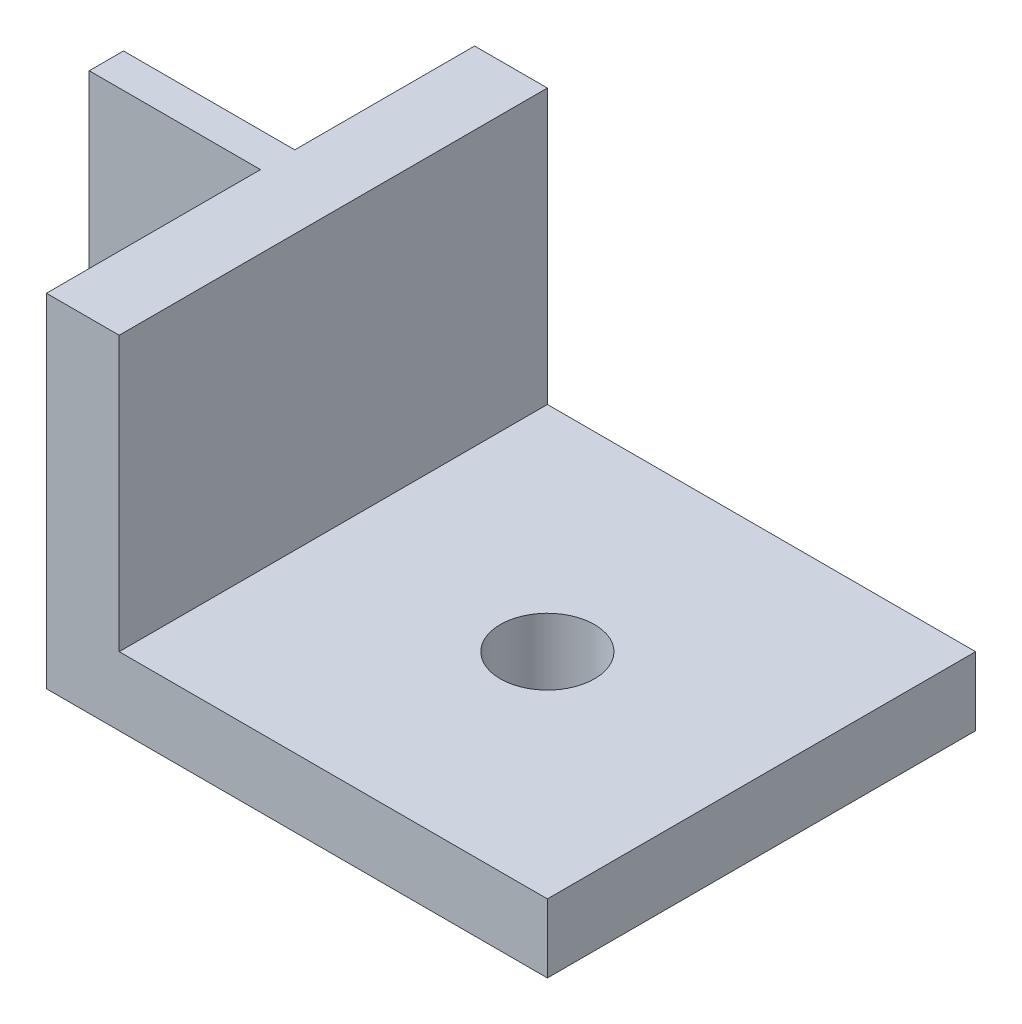
ISO-10303-21;
HEADER;
FILE_DESCRIPTION(('STEP AP214'),'2;1');
FILE_NAME('part.step','',(''),(''),'','','');
FILE_SCHEMA(('AUTOMOTIVE_DESIGN { 1 0 10303 214 1 1 1 1 }'));
ENDSEC;
DATA;
#1=APPLICATION_CONTEXT('core data for automotive mechanical design processes');
#2=APPLICATION_PROTOCOL_DEFINITION('international standard','automotive_design',2000,#1);
#3=PRODUCT_CONTEXT('',#1,'mechanical');
#4=PRODUCT('Part','Part','',(#3));
#5=PRODUCT_RELATED_PRODUCT_CATEGORY('part','',(#4));
#6=PRODUCT_DEFINITION_FORMATION('','',#4);
#7=PRODUCT_DEFINITION_CONTEXT('part definition',#1,'design');
#8=PRODUCT_DEFINITION('design','',#6,#7);
#9=PRODUCT_DEFINITION_SHAPE('','',#8);
#10=(LENGTH_UNIT() NAMED_UNIT(*) SI_UNIT(.MILLI.,.METRE.));
#11=(NAMED_UNIT(*) PLANE_ANGLE_UNIT() SI_UNIT($,.RADIAN.));
#12=(NAMED_UNIT(*) SI_UNIT($,.STERADIAN.) SOLID_ANGLE_UNIT());
#13=UNCERTAINTY_MEASURE_WITH_UNIT(LENGTH_MEASURE(1.E-05),#10,'distance_accuracy_value','');
#14=(GEOMETRIC_REPRESENTATION_CONTEXT(3) GLOBAL_UNCERTAINTY_ASSIGNED_CONTEXT((#13)) GLOBAL_UNIT_ASSIGNED_CONTEXT((#10,
#11,#12)) REPRESENTATION_CONTEXT('',''));
#15=CARTESIAN_POINT('',(0.,0.,0.));
#16=DIRECTION('',(0.,0.,1.));
#17=DIRECTION('',(1.,0.,0.));
#18=AXIS2_PLACEMENT_3D('',#15,#16,#17);
#19=CARTESIAN_POINT('',(-16.7491144139302,-23.,-12.5));
#20=DIRECTION('',(1.,0.,0.));
#21=DIRECTION('',(0.,0.,-1.));
#22=AXIS2_PLACEMENT_3D('',#19,#20,#21);
#23=PLANE('',#22);
#24=DIRECTION('',(0.,1.,0.));
#25=VECTOR('',#24,1.);
#26=CARTESIAN_POINT('',(-16.7491144139302,-10.1980390271856,0.));
#27=LINE('',#26,#25);
#28=CARTESIAN_POINT('',(-16.7491144139302,0.,0.));
#29=VERTEX_POINT('',#28);
#30=CARTESIAN_POINT('',(-16.7491144139302,20.,0.));
#31=VERTEX_POINT('',#30);
#32=EDGE_CURVE('E71',#29,#31,#27,.T.);
#33=ORIENTED_EDGE('',*,*,#32,.F.);
#34=DIRECTION('',(0.,0.,-1.));
#35=VECTOR('',#34,1.);
#36=CARTESIAN_POINT('',(-16.7491144139302,0.,0.));
#37=LINE('',#36,#35);
#38=CARTESIAN_POINT('',(-16.7491144139302,0.,12.5));
#39=VERTEX_POINT('',#38);
#40=EDGE_CURVE('E183',#39,#29,#37,.T.);
#41=ORIENTED_EDGE('',*,*,#40,.F.);
#42=DIRECTION('',(0.,1.,0.));
#43=VECTOR('',#42,1.);
#44=CARTESIAN_POINT('',(-16.7491144139302,-23.,12.5));
#45=LINE('',#44,#43);
#46=CARTESIAN_POINT('',(-16.7491144139302,20.,12.5));
#47=VERTEX_POINT('',#46);
#48=EDGE_CURVE('E176',#39,#47,#45,.T.);
#49=ORIENTED_EDGE('',*,*,#48,.T.);
#50=DIRECTION('',(0.,0.,-1.));
#51=VECTOR('',#50,1.);
#52=CARTESIAN_POINT('',(-16.7491144139302,20.,-12.5));
#53=LINE('',#52,#51);
#54=EDGE_CURVE('E173',#47,#31,#53,.T.);
#55=ORIENTED_EDGE('',*,*,#54,.T.);
#56=EDGE_LOOP('',(#33,#41,#49,#55));
#57=FACE_BOUND('',#56,.T.);
#58=ADVANCED_FACE('F47',(#57),#23,.F.);
#59=CARTESIAN_POINT('',(12.5,4.,0.));
#60=DIRECTION('',(1.,0.,0.));
#61=DIRECTION('',(0.,0.,-1.));
#62=AXIS2_PLACEMENT_3D('',#59,#60,#61);
#63=PLANE('',#62);
#64=DIRECTION('',(0.,0.,1.));
#65=VECTOR('',#64,1.);
#66=CARTESIAN_POINT('',(12.5,0.,0.));
#67=LINE('',#66,#65);
#68=CARTESIAN_POINT('',(12.5,0.,-12.5));
#69=VERTEX_POINT('',#68);
#70=CARTESIAN_POINT('',(12.5,0.,12.5));
#71=VERTEX_POINT('',#70);
#72=EDGE_CURVE('E226',#69,#71,#67,.T.);
#73=ORIENTED_EDGE('',*,*,#72,.F.);
#74=DIRECTION('',(0.,-1.,0.));
#75=VECTOR('',#74,1.);
#76=CARTESIAN_POINT('',(12.5,4.,-12.5));
#77=LINE('',#76,#75);
#78=CARTESIAN_POINT('',(12.5,4.,-12.5));
#79=VERTEX_POINT('',#78);
#80=EDGE_CURVE('E11',#79,#69,#77,.T.);
#81=ORIENTED_EDGE('',*,*,#80,.F.);
#82=DIRECTION('',(0.,0.,1.));
#83=VECTOR('',#82,1.);
#84=CARTESIAN_POINT('',(12.5,4.,0.));
#85=LINE('',#84,#83);
#86=CARTESIAN_POINT('',(12.5,4.,12.5));
#87=VERTEX_POINT('',#86);
#88=EDGE_CURVE('E208',#79,#87,#85,.T.);
#89=ORIENTED_EDGE('',*,*,#88,.T.);
#90=DIRECTION('',(0.,-1.,0.));
#91=VECTOR('',#90,1.);
#92=CARTESIAN_POINT('',(12.5,4.,12.5));
#93=LINE('',#92,#91);
#94=EDGE_CURVE('E56',#87,#71,#93,.T.);
#95=ORIENTED_EDGE('',*,*,#94,.T.);
#96=EDGE_LOOP('',(#73,#81,#89,#95));
#97=FACE_BOUND('',#96,.T.);
#98=ADVANCED_FACE('F239',(#97),#63,.T.);
#99=CARTESIAN_POINT('',(0.,4.,-12.5));
#100=DIRECTION('',(0.,0.,-1.));
#101=DIRECTION('',(-1.,0.,0.));
#102=AXIS2_PLACEMENT_3D('',#99,#100,#101);
#103=PLANE('',#102);
#104=DIRECTION('',(0.,1.,0.));
#105=VECTOR('',#104,1.);
#106=CARTESIAN_POINT('',(-16.7491144139302,-23.,-12.5));
#107=LINE('',#106,#105);
#108=CARTESIAN_POINT('',(-16.7491144139302,0.,-12.5));
#109=VERTEX_POINT('',#108);
#110=CARTESIAN_POINT('',(-16.7491144139302,20.,-12.5));
#111=VERTEX_POINT('',#110);
#112=EDGE_CURVE('E177',#109,#111,#107,.T.);
#113=ORIENTED_EDGE('',*,*,#112,.T.);
#114=DIRECTION('',(-1.,0.,0.));
#115=VECTOR('',#114,1.);
#116=CARTESIAN_POINT('',(0.,20.,-12.5));
#117=LINE('',#116,#115);
#118=CARTESIAN_POINT('',(-12.5,20.,-12.5));
#119=VERTEX_POINT('',#118);
#120=EDGE_CURVE('E194',#119,#111,#117,.T.);
#121=ORIENTED_EDGE('',*,*,#120,.F.);
#122=DIRECTION('',(0.,-1.,0.));
#123=VECTOR('',#122,1.);
#124=CARTESIAN_POINT('',(-12.5,20.,-12.5));
#125=LINE('',#124,#123);
#126=CARTESIAN_POINT('',(-12.5,4.,-12.5));
#127=VERTEX_POINT('',#126);
#128=EDGE_CURVE('E197',#119,#127,#125,.T.);
#129=ORIENTED_EDGE('',*,*,#128,.T.);
#130=DIRECTION('',(1.,0.,0.));
#131=VECTOR('',#130,1.);
#132=CARTESIAN_POINT('',(0.,4.,-12.5));
#133=LINE('',#132,#131);
#134=EDGE_CURVE('E213',#127,#79,#133,.T.);
#135=ORIENTED_EDGE('',*,*,#134,.T.);
#136=ORIENTED_EDGE('',*,*,#80,.T.);
#137=DIRECTION('',(1.,0.,0.));
#138=VECTOR('',#137,1.);
#139=CARTESIAN_POINT('',(0.,0.,-12.5));
#140=LINE('',#139,#138);
#141=EDGE_CURVE('E230',#109,#69,#140,.T.);
#142=ORIENTED_EDGE('',*,*,#141,.F.);
#143=EDGE_LOOP('',(#113,#121,#129,#135,#136,#142));
#144=FACE_BOUND('',#143,.T.);
#145=ADVANCED_FACE('F248',(#144),#103,.T.);
#146=CARTESIAN_POINT('',(0.,4.,0.));
#147=DIRECTION('',(0.,-1.,0.));
#148=DIRECTION('',(0.,0.,-1.));
#149=AXIS2_PLACEMENT_3D('',#146,#147,#148);
#150=CYLINDRICAL_SURFACE('',#149,2.75);
#151=CARTESIAN_POINT('',(0.,4.,0.));
#152=DIRECTION('',(0.,1.,0.));
#153=DIRECTION('',(0.,0.,1.));
#154=AXIS2_PLACEMENT_3D('',#151,#152,#153);
#155=CIRCLE('',#154,2.75);
#156=CARTESIAN_POINT('',(0.,4.,2.75));
#157=VERTEX_POINT('',#156);
#158=EDGE_CURVE('E205',#157,#157,#155,.T.);
#159=ORIENTED_EDGE('',*,*,#158,.T.);
#160=EDGE_LOOP('',(#159));
#161=FACE_BOUND('',#160,.T.);
#162=CARTESIAN_POINT('',(0.,0.,0.));
#163=DIRECTION('',(0.,1.,0.));
#164=DIRECTION('',(0.,0.,1.));
#165=AXIS2_PLACEMENT_3D('',#162,#163,#164);
#166=CIRCLE('',#165,2.75);
#167=CARTESIAN_POINT('',(0.,0.,2.75));
#168=VERTEX_POINT('',#167);
#169=EDGE_CURVE('E204',#168,#168,#166,.T.);
#170=ORIENTED_EDGE('',*,*,#169,.F.);
#171=EDGE_LOOP('',(#170));
#172=FACE_BOUND('',#171,.T.);
#173=ADVANCED_FACE('F49',(#161,#172),#150,.F.);
#174=CARTESIAN_POINT('',(0.,4.,12.5));
#175=DIRECTION('',(0.,0.,-1.));
#176=DIRECTION('',(-1.,0.,0.));
#177=AXIS2_PLACEMENT_3D('',#174,#175,#176);
#178=PLANE('',#177);
#179=DIRECTION('',(-1.,0.,0.));
#180=VECTOR('',#179,1.);
#181=CARTESIAN_POINT('',(0.,20.,12.5));
#182=LINE('',#181,#180);
#183=CARTESIAN_POINT('',(-12.5,20.,12.5));
#184=VERTEX_POINT('',#183);
#185=EDGE_CURVE('E186',#184,#47,#182,.T.);
#186=ORIENTED_EDGE('',*,*,#185,.T.);
#187=ORIENTED_EDGE('',*,*,#48,.F.);
#188=DIRECTION('',(1.,0.,0.));
#189=VECTOR('',#188,1.);
#190=CARTESIAN_POINT('',(0.,0.,12.5));
#191=LINE('',#190,#189);
#192=EDGE_CURVE('E209',#39,#71,#191,.T.);
#193=ORIENTED_EDGE('',*,*,#192,.T.);
#194=ORIENTED_EDGE('',*,*,#94,.F.);
#195=DIRECTION('',(1.,0.,0.));
#196=VECTOR('',#195,1.);
#197=CARTESIAN_POINT('',(0.,4.,12.5));
#198=LINE('',#197,#196);
#199=CARTESIAN_POINT('',(-12.5,4.,12.5));
#200=VERTEX_POINT('',#199);
#201=EDGE_CURVE('E220',#200,#87,#198,.T.);
#202=ORIENTED_EDGE('',*,*,#201,.F.);
#203=DIRECTION('',(0.,-1.,0.));
#204=VECTOR('',#203,1.);
#205=CARTESIAN_POINT('',(-12.5,20.,12.5));
#206=LINE('',#205,#204);
#207=EDGE_CURVE('E201',#184,#200,#206,.T.);
#208=ORIENTED_EDGE('',*,*,#207,.F.);
#209=EDGE_LOOP('',(#186,#187,#193,#194,#202,#208));
#210=FACE_BOUND('',#209,.T.);
#211=ADVANCED_FACE('F252',(#210),#178,.F.);
#212=CARTESIAN_POINT('',(0.,4.,0.));
#213=DIRECTION('',(0.,1.,0.));
#214=DIRECTION('',(0.,0.,1.));
#215=AXIS2_PLACEMENT_3D('',#212,#213,#214);
#216=PLANE('',#215);
#217=ORIENTED_EDGE('',*,*,#158,.F.);
#218=EDGE_LOOP('',(#217));
#219=FACE_BOUND('',#218,.T.);
#220=ORIENTED_EDGE('',*,*,#88,.F.);
#221=ORIENTED_EDGE('',*,*,#134,.F.);
#222=DIRECTION('',(0.,0.,1.));
#223=VECTOR('',#222,1.);
#224=CARTESIAN_POINT('',(-12.5,4.,0.));
#225=LINE('',#224,#223);
#226=EDGE_CURVE('E216',#127,#200,#225,.T.);
#227=ORIENTED_EDGE('',*,*,#226,.T.);
#228=ORIENTED_EDGE('',*,*,#201,.T.);
#229=EDGE_LOOP('',(#220,#221,#227,#228));
#230=FACE_BOUND('',#229,.T.);
#231=ADVANCED_FACE('F251',(#219,#230),#216,.T.);
#232=CARTESIAN_POINT('',(0.,0.,0.));
#233=DIRECTION('',(0.,1.,0.));
#234=DIRECTION('',(0.,0.,1.));
#235=AXIS2_PLACEMENT_3D('',#232,#233,#234);
#236=PLANE('',#235);
#237=ORIENTED_EDGE('',*,*,#169,.T.);
#238=EDGE_LOOP('',(#237));
#239=FACE_BOUND('',#238,.T.);
#240=ORIENTED_EDGE('',*,*,#192,.F.);
#241=ORIENTED_EDGE('',*,*,#40,.T.);
#242=DIRECTION('',(-1.,0.,0.));
#243=VECTOR('',#242,1.);
#244=CARTESIAN_POINT('',(-16.7491144139302,0.,0.));
#245=LINE('',#244,#243);
#246=CARTESIAN_POINT('',(-26.7491144139302,0.,0.));
#247=VERTEX_POINT('',#246);
#248=EDGE_CURVE('E159',#29,#247,#245,.T.);
#249=ORIENTED_EDGE('',*,*,#248,.T.);
#250=DIRECTION('',(0.,0.,-1.));
#251=VECTOR('',#250,1.);
#252=CARTESIAN_POINT('',(-26.7491144139302,0.,0.));
#253=LINE('',#252,#251);
#254=CARTESIAN_POINT('',(-26.7491144139302,0.,-2.));
#255=VERTEX_POINT('',#254);
#256=EDGE_CURVE('E166',#247,#255,#253,.T.);
#257=ORIENTED_EDGE('',*,*,#256,.T.);
#258=DIRECTION('',(1.,0.,0.));
#259=VECTOR('',#258,1.);
#260=CARTESIAN_POINT('',(-16.7491144139302,0.,-2.));
#261=LINE('',#260,#259);
#262=CARTESIAN_POINT('',(-16.7491144139302,0.,-2.));
#263=VERTEX_POINT('',#262);
#264=EDGE_CURVE('E132',#255,#263,#261,.T.);
#265=ORIENTED_EDGE('',*,*,#264,.T.);
#266=EDGE_CURVE('E63',#263,#109,#37,.T.);
#267=ORIENTED_EDGE('',*,*,#266,.T.);
#268=ORIENTED_EDGE('',*,*,#141,.T.);
#269=ORIENTED_EDGE('',*,*,#72,.T.);
#270=EDGE_LOOP('',(#240,#241,#249,#257,#265,#267,#268,#269));
#271=FACE_BOUND('',#270,.T.);
#272=ADVANCED_FACE('F245',(#239,#271),#236,.F.);
#273=CARTESIAN_POINT('',(-12.5,20.,0.));
#274=DIRECTION('',(1.,0.,0.));
#275=DIRECTION('',(0.,0.,-1.));
#276=AXIS2_PLACEMENT_3D('',#273,#274,#275);
#277=PLANE('',#276);
#278=ORIENTED_EDGE('',*,*,#226,.F.);
#279=ORIENTED_EDGE('',*,*,#128,.F.);
#280=DIRECTION('',(0.,0.,1.));
#281=VECTOR('',#280,1.);
#282=CARTESIAN_POINT('',(-12.5,20.,0.));
#283=LINE('',#282,#281);
#284=EDGE_CURVE('E190',#119,#184,#283,.T.);
#285=ORIENTED_EDGE('',*,*,#284,.T.);
#286=ORIENTED_EDGE('',*,*,#207,.T.);
#287=EDGE_LOOP('',(#278,#279,#285,#286));
#288=FACE_BOUND('',#287,.T.);
#289=ADVANCED_FACE('F257',(#288),#277,.T.);
#290=CARTESIAN_POINT('',(0.,20.,0.));
#291=DIRECTION('',(0.,1.,0.));
#292=DIRECTION('',(0.,0.,1.));
#293=AXIS2_PLACEMENT_3D('',#290,#291,#292);
#294=PLANE('',#293);
#295=ORIENTED_EDGE('',*,*,#54,.F.);
#296=ORIENTED_EDGE('',*,*,#185,.F.);
#297=ORIENTED_EDGE('',*,*,#284,.F.);
#298=ORIENTED_EDGE('',*,*,#120,.T.);
#299=CARTESIAN_POINT('',(-16.7491144139302,20.,-2.));
#300=VERTEX_POINT('',#299);
#301=EDGE_CURVE('E153',#300,#111,#53,.T.);
#302=ORIENTED_EDGE('',*,*,#301,.F.);
#303=DIRECTION('',(-1.,0.,0.));
#304=VECTOR('',#303,1.);
#305=CARTESIAN_POINT('',(-16.7491144139302,20.,-2.));
#306=LINE('',#305,#304);
#307=CARTESIAN_POINT('',(-26.7491144139302,20.,-2.));
#308=VERTEX_POINT('',#307);
#309=EDGE_CURVE('E131',#300,#308,#306,.T.);
#310=ORIENTED_EDGE('',*,*,#309,.T.);
#311=DIRECTION('',(0.,0.,1.));
#312=VECTOR('',#311,1.);
#313=CARTESIAN_POINT('',(-26.7491144139302,20.,0.));
#314=LINE('',#313,#312);
#315=CARTESIAN_POINT('',(-26.7491144139302,20.,0.));
#316=VERTEX_POINT('',#315);
#317=EDGE_CURVE('E140',#308,#316,#314,.T.);
#318=ORIENTED_EDGE('',*,*,#317,.T.);
#319=DIRECTION('',(1.,0.,0.));
#320=VECTOR('',#319,1.);
#321=CARTESIAN_POINT('',(-16.7491144139302,20.,0.));
#322=LINE('',#321,#320);
#323=EDGE_CURVE('E147',#316,#31,#322,.T.);
#324=ORIENTED_EDGE('',*,*,#323,.T.);
#325=EDGE_LOOP('',(#295,#296,#297,#298,#302,#310,#318,#324));
#326=FACE_BOUND('',#325,.T.);
#327=ADVANCED_FACE('F151',(#326),#294,.T.);
#328=ORIENTED_EDGE('',*,*,#266,.F.);
#329=DIRECTION('',(0.,1.,0.));
#330=VECTOR('',#329,1.);
#331=CARTESIAN_POINT('',(-16.7491144139302,-10.1980390271856,-2.));
#332=LINE('',#331,#330);
#333=EDGE_CURVE('E137',#263,#300,#332,.T.);
#334=ORIENTED_EDGE('',*,*,#333,.T.);
#335=ORIENTED_EDGE('',*,*,#301,.T.);
#336=ORIENTED_EDGE('',*,*,#112,.F.);
#337=EDGE_LOOP('',(#328,#334,#335,#336));
#338=FACE_BOUND('',#337,.T.);
#339=ADVANCED_FACE('F259',(#338),#23,.F.);
#340=CARTESIAN_POINT('',(-16.7491144139302,-10.1980390271856,0.));
#341=DIRECTION('',(0.,0.,1.));
#342=DIRECTION('',(1.,0.,0.));
#343=AXIS2_PLACEMENT_3D('',#340,#341,#342);
#344=PLANE('',#343);
#345=ORIENTED_EDGE('',*,*,#248,.F.);
#346=ORIENTED_EDGE('',*,*,#32,.T.);
#347=ORIENTED_EDGE('',*,*,#323,.F.);
#348=DIRECTION('',(0.,1.,0.));
#349=VECTOR('',#348,1.);
#350=CARTESIAN_POINT('',(-26.7491144139302,-10.1980390271856,0.));
#351=LINE('',#350,#349);
#352=EDGE_CURVE('E136',#247,#316,#351,.T.);
#353=ORIENTED_EDGE('',*,*,#352,.F.);
#354=EDGE_LOOP('',(#345,#346,#347,#353));
#355=FACE_BOUND('',#354,.T.);
#356=ADVANCED_FACE('F265',(#355),#344,.T.);
#357=CARTESIAN_POINT('',(-26.7491144139302,-10.1980390271856,0.));
#358=DIRECTION('',(-1.,0.,0.));
#359=DIRECTION('',(0.,0.,1.));
#360=AXIS2_PLACEMENT_3D('',#357,#358,#359);
#361=PLANE('',#360);
#362=ORIENTED_EDGE('',*,*,#256,.F.);
#363=ORIENTED_EDGE('',*,*,#352,.T.);
#364=ORIENTED_EDGE('',*,*,#317,.F.);
#365=DIRECTION('',(0.,1.,0.));
#366=VECTOR('',#365,1.);
#367=CARTESIAN_POINT('',(-26.7491144139302,-10.1980390271856,-2.));
#368=LINE('',#367,#366);
#369=EDGE_CURVE('E126',#255,#308,#368,.T.);
#370=ORIENTED_EDGE('',*,*,#369,.F.);
#371=EDGE_LOOP('',(#362,#363,#364,#370));
#372=FACE_BOUND('',#371,.T.);
#373=ADVANCED_FACE('F141',(#372),#361,.T.);
#374=CARTESIAN_POINT('',(-16.7491144139302,-10.1980390271856,-2.));
#375=DIRECTION('',(0.,0.,-1.));
#376=DIRECTION('',(-1.,0.,0.));
#377=AXIS2_PLACEMENT_3D('',#374,#375,#376);
#378=PLANE('',#377);
#379=ORIENTED_EDGE('',*,*,#264,.F.);
#380=ORIENTED_EDGE('',*,*,#369,.T.);
#381=ORIENTED_EDGE('',*,*,#309,.F.);
#382=ORIENTED_EDGE('',*,*,#333,.F.);
#383=EDGE_LOOP('',(#379,#380,#381,#382));
#384=FACE_BOUND('',#383,.T.);
#385=ADVANCED_FACE('F128',(#384),#378,.T.);
#386=CLOSED_SHELL('',(#58,#98,#145,#173,#211,#231,#272,#289,#327,#339,#356,#373,#385));
#387=MANIFOLD_SOLID_BREP('B2',#386);
#388=ADVANCED_BREP_SHAPE_REPRESENTATION('',(#18,#387),#14);
#389=SHAPE_DEFINITION_REPRESENTATION(#9,#388);
ENDSEC;
END-ISO-10303-21;
